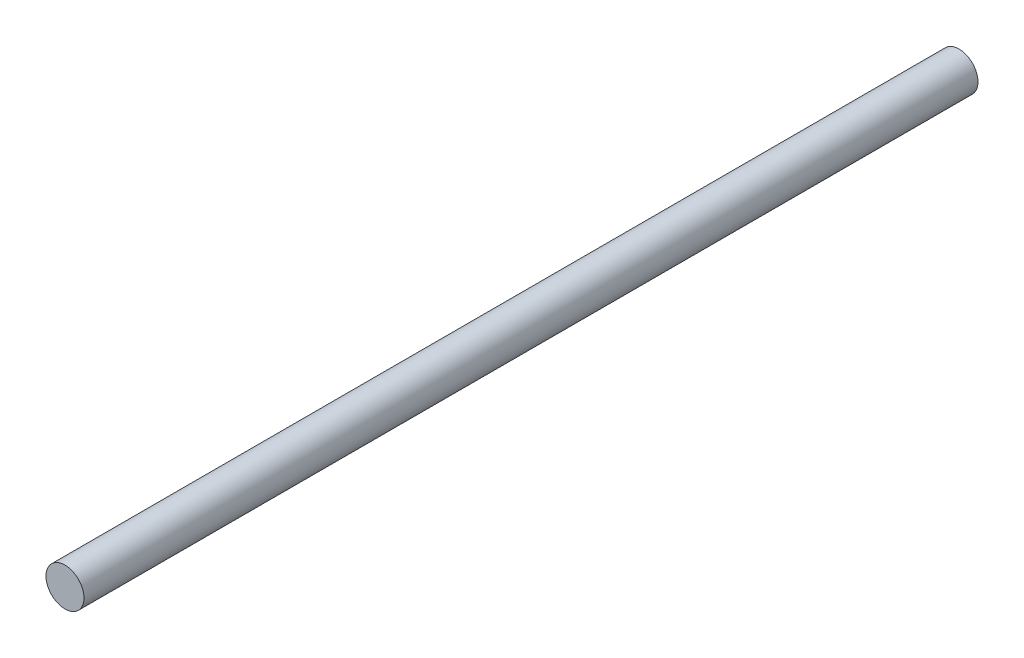
ISO-10303-21;
HEADER;
FILE_DESCRIPTION(('STEP AP214'),'2;1');
FILE_NAME('part.step','',(''),(''),'','','');
FILE_SCHEMA(('AUTOMOTIVE_DESIGN { 1 0 10303 214 1 1 1 1 }'));
ENDSEC;
DATA;
#1=APPLICATION_CONTEXT('core data for automotive mechanical design processes');
#2=APPLICATION_PROTOCOL_DEFINITION('international standard','automotive_design',2000,#1);
#3=PRODUCT_CONTEXT('',#1,'mechanical');
#4=PRODUCT('Part','Part','',(#3));
#5=PRODUCT_RELATED_PRODUCT_CATEGORY('part','',(#4));
#6=PRODUCT_DEFINITION_FORMATION('','',#4);
#7=PRODUCT_DEFINITION_CONTEXT('part definition',#1,'design');
#8=PRODUCT_DEFINITION('design','',#6,#7);
#9=PRODUCT_DEFINITION_SHAPE('','',#8);
#10=(LENGTH_UNIT() NAMED_UNIT(*) SI_UNIT(.MILLI.,.METRE.));
#11=(NAMED_UNIT(*) PLANE_ANGLE_UNIT() SI_UNIT($,.RADIAN.));
#12=(NAMED_UNIT(*) SI_UNIT($,.STERADIAN.) SOLID_ANGLE_UNIT());
#13=UNCERTAINTY_MEASURE_WITH_UNIT(LENGTH_MEASURE(1.E-05),#10,'distance_accuracy_value','');
#14=(GEOMETRIC_REPRESENTATION_CONTEXT(3) GLOBAL_UNCERTAINTY_ASSIGNED_CONTEXT((#13)) GLOBAL_UNIT_ASSIGNED_CONTEXT((#10,
#11,#12)) REPRESENTATION_CONTEXT('',''));
#15=CARTESIAN_POINT('',(0.,0.,0.));
#16=DIRECTION('',(0.,0.,1.));
#17=DIRECTION('',(1.,0.,0.));
#18=AXIS2_PLACEMENT_3D('',#15,#16,#17);
#19=CARTESIAN_POINT('',(0.,0.,596.9));
#20=DIRECTION('',(0.,0.,-1.));
#21=DIRECTION('',(-1.,0.,0.));
#22=AXIS2_PLACEMENT_3D('',#19,#20,#21);
#23=CYLINDRICAL_SURFACE('',#22,12.7);
#24=CARTESIAN_POINT('',(0.,0.,596.9));
#25=DIRECTION('',(0.,0.,1.));
#26=DIRECTION('',(1.,0.,0.));
#27=AXIS2_PLACEMENT_3D('',#24,#25,#26);
#28=CIRCLE('',#27,12.7);
#29=CARTESIAN_POINT('',(12.7,0.,596.9));
#30=VERTEX_POINT('',#29);
#31=EDGE_CURVE('E10',#30,#30,#28,.T.);
#32=ORIENTED_EDGE('',*,*,#31,.F.);
#33=EDGE_LOOP('',(#32));
#34=FACE_BOUND('',#33,.T.);
#35=CARTESIAN_POINT('',(0.,0.,0.));
#36=DIRECTION('',(0.,0.,1.));
#37=DIRECTION('',(1.,0.,0.));
#38=AXIS2_PLACEMENT_3D('',#35,#36,#37);
#39=CIRCLE('',#38,12.7);
#40=CARTESIAN_POINT('',(12.7,0.,0.));
#41=VERTEX_POINT('',#40);
#42=EDGE_CURVE('E34',#41,#41,#39,.T.);
#43=ORIENTED_EDGE('',*,*,#42,.T.);
#44=EDGE_LOOP('',(#43));
#45=FACE_BOUND('',#44,.T.);
#46=ADVANCED_FACE('F31',(#34,#45),#23,.T.);
#47=CARTESIAN_POINT('',(0.,0.,596.9));
#48=DIRECTION('',(0.,0.,1.));
#49=DIRECTION('',(1.,0.,0.));
#50=AXIS2_PLACEMENT_3D('',#47,#48,#49);
#51=PLANE('',#50);
#52=ORIENTED_EDGE('',*,*,#31,.T.);
#53=EDGE_LOOP('',(#52));
#54=FACE_BOUND('',#53,.T.);
#55=ADVANCED_FACE('F46',(#54),#51,.T.);
#56=CARTESIAN_POINT('',(0.,0.,0.));
#57=DIRECTION('',(0.,0.,1.));
#58=DIRECTION('',(1.,0.,0.));
#59=AXIS2_PLACEMENT_3D('',#56,#57,#58);
#60=PLANE('',#59);
#61=ORIENTED_EDGE('',*,*,#42,.F.);
#62=EDGE_LOOP('',(#61));
#63=FACE_BOUND('',#62,.T.);
#64=ADVANCED_FACE('F44',(#63),#60,.F.);
#65=CLOSED_SHELL('',(#46,#55,#64));
#66=MANIFOLD_SOLID_BREP('B2',#65);
#67=ADVANCED_BREP_SHAPE_REPRESENTATION('',(#18,#66),#14);
#68=SHAPE_DEFINITION_REPRESENTATION(#9,#67);
ENDSEC;
END-ISO-10303-21;
